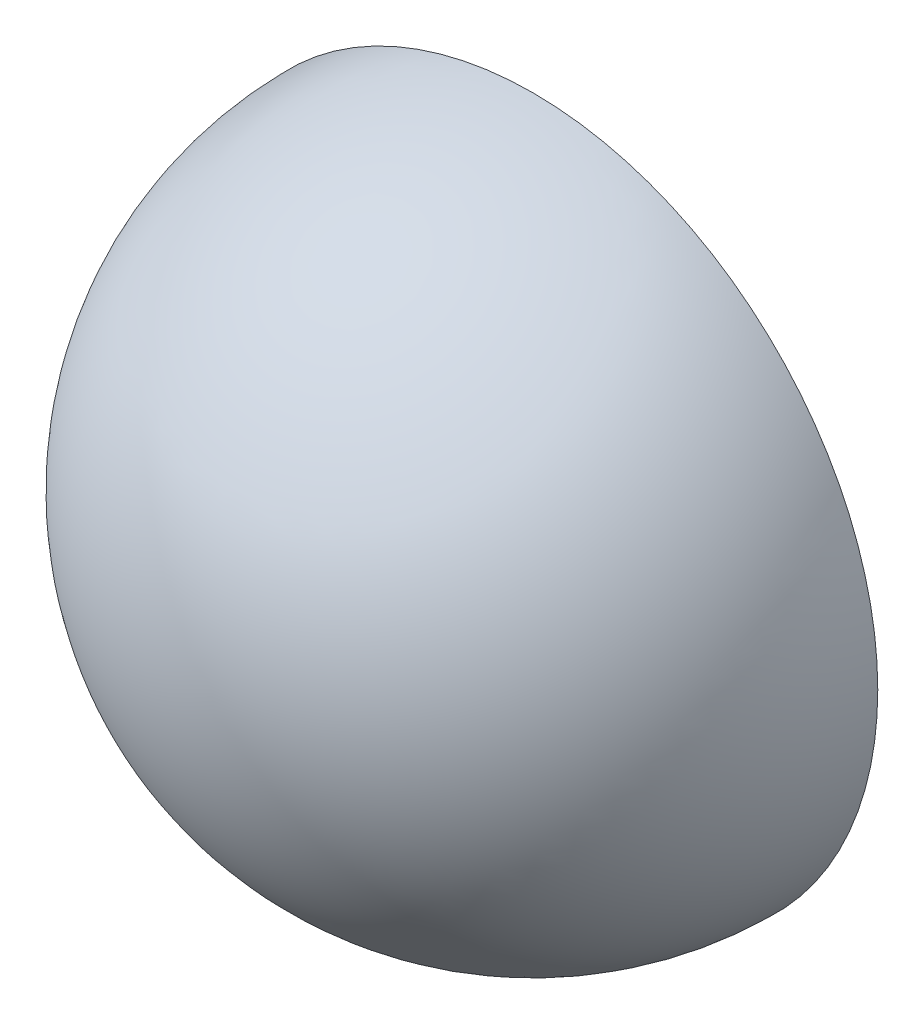
ISO-10303-21;
HEADER;
FILE_DESCRIPTION(('STEP AP214'),'2;1');
FILE_NAME('part.step','',(''),(''),'','','');
FILE_SCHEMA(('AUTOMOTIVE_DESIGN { 1 0 10303 214 1 1 1 1 }'));
ENDSEC;
DATA;
#1=APPLICATION_CONTEXT('core data for automotive mechanical design processes');
#2=APPLICATION_PROTOCOL_DEFINITION('international standard','automotive_design',2000,#1);
#3=PRODUCT_CONTEXT('',#1,'mechanical');
#4=PRODUCT('Part','Part','',(#3));
#5=PRODUCT_RELATED_PRODUCT_CATEGORY('part','',(#4));
#6=PRODUCT_DEFINITION_FORMATION('','',#4);
#7=PRODUCT_DEFINITION_CONTEXT('part definition',#1,'design');
#8=PRODUCT_DEFINITION('design','',#6,#7);
#9=PRODUCT_DEFINITION_SHAPE('','',#8);
#10=(LENGTH_UNIT() NAMED_UNIT(*) SI_UNIT(.MILLI.,.METRE.));
#11=(NAMED_UNIT(*) PLANE_ANGLE_UNIT() SI_UNIT($,.RADIAN.));
#12=(NAMED_UNIT(*) SI_UNIT($,.STERADIAN.) SOLID_ANGLE_UNIT());
#13=UNCERTAINTY_MEASURE_WITH_UNIT(LENGTH_MEASURE(1.E-05),#10,'distance_accuracy_value','');
#14=(GEOMETRIC_REPRESENTATION_CONTEXT(3) GLOBAL_UNCERTAINTY_ASSIGNED_CONTEXT((#13)) GLOBAL_UNIT_ASSIGNED_CONTEXT((#10,
#11,#12)) REPRESENTATION_CONTEXT('',''));
#15=CARTESIAN_POINT('',(0.,0.,0.));
#16=DIRECTION('',(0.,0.,1.));
#17=DIRECTION('',(1.,0.,0.));
#18=AXIS2_PLACEMENT_3D('',#15,#16,#17);
#19=CARTESIAN_POINT('',(0.,0.,0.));
#20=DIRECTION('',(0.,0.,1.));
#21=DIRECTION('',(0.,1.,0.));
#22=AXIS2_PLACEMENT_3D('',#19,#20,#21);
#23=SPHERICAL_SURFACE('',#22,23.85);
#24=CARTESIAN_POINT('',(0.,0.,0.));
#25=DIRECTION('',(0.,0.,1.));
#26=DIRECTION('',(1.,0.,0.));
#27=AXIS2_PLACEMENT_3D('',#24,#25,#26);
#28=CIRCLE('',#27,23.85);
#29=CARTESIAN_POINT('',(23.85,0.,0.));
#30=VERTEX_POINT('',#29);
#31=EDGE_CURVE('E42',#30,#30,#28,.T.);
#32=ORIENTED_EDGE('',*,*,#31,.T.);
#33=EDGE_LOOP('',(#32));
#34=FACE_BOUND('',#33,.T.);
#35=ADVANCED_FACE('F36',(#34),#23,.T.);
#36=CARTESIAN_POINT('',(0.,0.,0.));
#37=DIRECTION('',(0.,0.,1.));
#38=DIRECTION('',(0.,1.,0.));
#39=AXIS2_PLACEMENT_3D('',#36,#37,#38);
#40=SPHERICAL_SURFACE('',#39,21.85);
#41=CARTESIAN_POINT('',(0.,0.,0.));
#42=DIRECTION('',(0.,0.,1.));
#43=DIRECTION('',(1.,0.,0.));
#44=AXIS2_PLACEMENT_3D('',#41,#42,#43);
#45=CIRCLE('',#44,21.85);
#46=CARTESIAN_POINT('',(21.85,0.,0.));
#47=VERTEX_POINT('',#46);
#48=EDGE_CURVE('E10',#47,#47,#45,.T.);
#49=ORIENTED_EDGE('',*,*,#48,.F.);
#50=EDGE_LOOP('',(#49));
#51=FACE_BOUND('',#50,.T.);
#52=ADVANCED_FACE('F51',(#51),#40,.F.);
#53=CARTESIAN_POINT('',(0.,23.85,0.));
#54=DIRECTION('',(0.,0.,-1.));
#55=DIRECTION('',(-1.,0.,0.));
#56=AXIS2_PLACEMENT_3D('',#53,#54,#55);
#57=PLANE('',#56);
#58=ORIENTED_EDGE('',*,*,#48,.T.);
#59=EDGE_LOOP('',(#58));
#60=FACE_BOUND('',#59,.T.);
#61=ORIENTED_EDGE('',*,*,#31,.F.);
#62=EDGE_LOOP('',(#61));
#63=FACE_BOUND('',#62,.T.);
#64=ADVANCED_FACE('F49',(#60,#63),#57,.T.);
#65=CLOSED_SHELL('',(#35,#52,#64));
#66=MANIFOLD_SOLID_BREP('B2',#65);
#67=ADVANCED_BREP_SHAPE_REPRESENTATION('',(#18,#66),#14);
#68=SHAPE_DEFINITION_REPRESENTATION(#9,#67);
ENDSEC;
END-ISO-10303-21;
